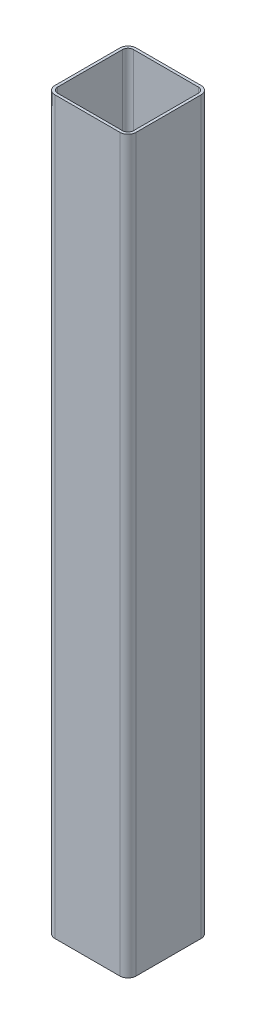
ISO-10303-21;
HEADER;
FILE_DESCRIPTION(('STEP AP214'),'2;1');
FILE_NAME('part.step','',(''),(''),'','','');
FILE_SCHEMA(('AUTOMOTIVE_DESIGN { 1 0 10303 214 1 1 1 1 }'));
ENDSEC;
DATA;
#1=APPLICATION_CONTEXT('core data for automotive mechanical design processes');
#2=APPLICATION_PROTOCOL_DEFINITION('international standard','automotive_design',2000,#1);
#3=PRODUCT_CONTEXT('',#1,'mechanical');
#4=PRODUCT('Part','Part','',(#3));
#5=PRODUCT_RELATED_PRODUCT_CATEGORY('part','',(#4));
#6=PRODUCT_DEFINITION_FORMATION('','',#4);
#7=PRODUCT_DEFINITION_CONTEXT('part definition',#1,'design');
#8=PRODUCT_DEFINITION('design','',#6,#7);
#9=PRODUCT_DEFINITION_SHAPE('','',#8);
#10=(LENGTH_UNIT() NAMED_UNIT(*) SI_UNIT(.MILLI.,.METRE.));
#11=(NAMED_UNIT(*) PLANE_ANGLE_UNIT() SI_UNIT($,.RADIAN.));
#12=(NAMED_UNIT(*) SI_UNIT($,.STERADIAN.) SOLID_ANGLE_UNIT());
#13=UNCERTAINTY_MEASURE_WITH_UNIT(LENGTH_MEASURE(1.E-05),#10,'distance_accuracy_value','');
#14=(GEOMETRIC_REPRESENTATION_CONTEXT(3) GLOBAL_UNCERTAINTY_ASSIGNED_CONTEXT((#13)) GLOBAL_UNIT_ASSIGNED_CONTEXT((#10,
#11,#12)) REPRESENTATION_CONTEXT('',''));
#15=CARTESIAN_POINT('',(0.,0.,0.));
#16=DIRECTION('',(0.,0.,1.));
#17=DIRECTION('',(1.,0.,0.));
#18=AXIS2_PLACEMENT_3D('',#15,#16,#17);
#19=CARTESIAN_POINT('',(24.,270.,24.));
#20=DIRECTION('',(0.,-1.,0.));
#21=DIRECTION('',(0.,0.,-1.));
#22=AXIS2_PLACEMENT_3D('',#19,#20,#21);
#23=PLANE('',#22);
#24=CARTESIAN_POINT('',(24.,270.,24.));
#25=DIRECTION('',(0.,1.,0.));
#26=DIRECTION('',(0.,0.,-1.));
#27=AXIS2_PLACEMENT_3D('',#24,#25,#26);
#28=CIRCLE('',#27,6.);
#29=CARTESIAN_POINT('',(24.,270.,30.));
#30=VERTEX_POINT('',#29);
#31=CARTESIAN_POINT('',(30.,270.,24.));
#32=VERTEX_POINT('',#31);
#33=EDGE_CURVE('E199',#30,#32,#28,.T.);
#34=ORIENTED_EDGE('',*,*,#33,.T.);
#35=DIRECTION('',(0.,0.,-1.));
#36=VECTOR('',#35,1.);
#37=CARTESIAN_POINT('',(30.,270.,24.));
#38=LINE('',#37,#36);
#39=CARTESIAN_POINT('',(30.,270.,-24.));
#40=VERTEX_POINT('',#39);
#41=EDGE_CURVE('E202',#32,#40,#38,.T.);
#42=ORIENTED_EDGE('',*,*,#41,.T.);
#43=CARTESIAN_POINT('',(24.,270.,-24.));
#44=DIRECTION('',(0.,1.,0.));
#45=DIRECTION('',(0.,0.,1.));
#46=AXIS2_PLACEMENT_3D('',#43,#44,#45);
#47=CIRCLE('',#46,6.);
#48=CARTESIAN_POINT('',(24.,270.,-30.));
#49=VERTEX_POINT('',#48);
#50=EDGE_CURVE('E205',#40,#49,#47,.T.);
#51=ORIENTED_EDGE('',*,*,#50,.T.);
#52=DIRECTION('',(-1.,0.,0.));
#53=VECTOR('',#52,1.);
#54=CARTESIAN_POINT('',(-24.,270.,-30.));
#55=LINE('',#54,#53);
#56=CARTESIAN_POINT('',(-24.,270.,-30.));
#57=VERTEX_POINT('',#56);
#58=EDGE_CURVE('E207',#49,#57,#55,.T.);
#59=ORIENTED_EDGE('',*,*,#58,.T.);
#60=CARTESIAN_POINT('',(-24.,270.,-24.));
#61=DIRECTION('',(0.,1.,0.));
#62=DIRECTION('',(0.,0.,1.));
#63=AXIS2_PLACEMENT_3D('',#60,#61,#62);
#64=CIRCLE('',#63,6.);
#65=CARTESIAN_POINT('',(-30.,270.,-24.));
#66=VERTEX_POINT('',#65);
#67=EDGE_CURVE('E209',#57,#66,#64,.T.);
#68=ORIENTED_EDGE('',*,*,#67,.T.);
#69=DIRECTION('',(0.,0.,1.));
#70=VECTOR('',#69,1.);
#71=CARTESIAN_POINT('',(-30.,270.,24.));
#72=LINE('',#71,#70);
#73=CARTESIAN_POINT('',(-30.,270.,24.));
#74=VERTEX_POINT('',#73);
#75=EDGE_CURVE('E211',#66,#74,#72,.T.);
#76=ORIENTED_EDGE('',*,*,#75,.T.);
#77=CARTESIAN_POINT('',(-24.,270.,24.));
#78=DIRECTION('',(0.,1.,0.));
#79=DIRECTION('',(0.,0.,-1.));
#80=AXIS2_PLACEMENT_3D('',#77,#78,#79);
#81=CIRCLE('',#80,6.);
#82=CARTESIAN_POINT('',(-24.,270.,30.));
#83=VERTEX_POINT('',#82);
#84=EDGE_CURVE('E213',#74,#83,#81,.T.);
#85=ORIENTED_EDGE('',*,*,#84,.T.);
#86=DIRECTION('',(1.,0.,0.));
#87=VECTOR('',#86,1.);
#88=CARTESIAN_POINT('',(-24.,270.,30.));
#89=LINE('',#88,#87);
#90=EDGE_CURVE('E215',#83,#30,#89,.T.);
#91=ORIENTED_EDGE('',*,*,#90,.T.);
#92=EDGE_LOOP('',(#34,#42,#51,#59,#68,#76,#85,#91));
#93=FACE_BOUND('',#92,.T.);
#94=CARTESIAN_POINT('',(24.,270.,24.));
#95=DIRECTION('',(0.,-1.,0.));
#96=DIRECTION('',(0.,0.,-1.));
#97=AXIS2_PLACEMENT_3D('',#94,#95,#96);
#98=CIRCLE('',#97,4.);
#99=CARTESIAN_POINT('',(24.,270.,28.));
#100=VERTEX_POINT('',#99);
#101=CARTESIAN_POINT('',(28.,270.,24.));
#102=VERTEX_POINT('',#101);
#103=EDGE_CURVE('E170',#100,#102,#98,.F.);
#104=ORIENTED_EDGE('',*,*,#103,.F.);
#105=DIRECTION('',(1.,0.,0.));
#106=VECTOR('',#105,1.);
#107=CARTESIAN_POINT('',(24.,270.,28.));
#108=LINE('',#107,#106);
#109=CARTESIAN_POINT('',(-24.,270.,28.));
#110=VERTEX_POINT('',#109);
#111=EDGE_CURVE('E152',#110,#100,#108,.T.);
#112=ORIENTED_EDGE('',*,*,#111,.F.);
#113=CARTESIAN_POINT('',(-24.,270.,24.));
#114=DIRECTION('',(0.,-1.,0.));
#115=DIRECTION('',(0.,0.,-1.));
#116=AXIS2_PLACEMENT_3D('',#113,#114,#115);
#117=CIRCLE('',#116,4.);
#118=CARTESIAN_POINT('',(-28.,270.,24.));
#119=VERTEX_POINT('',#118);
#120=EDGE_CURVE('E196',#119,#110,#117,.F.);
#121=ORIENTED_EDGE('',*,*,#120,.F.);
#122=DIRECTION('',(0.,0.,1.));
#123=VECTOR('',#122,1.);
#124=CARTESIAN_POINT('',(-28.,270.,24.));
#125=LINE('',#124,#123);
#126=CARTESIAN_POINT('',(-28.,270.,-24.));
#127=VERTEX_POINT('',#126);
#128=EDGE_CURVE('E194',#127,#119,#125,.T.);
#129=ORIENTED_EDGE('',*,*,#128,.F.);
#130=CARTESIAN_POINT('',(-24.,270.,-24.));
#131=DIRECTION('',(0.,-1.,0.));
#132=DIRECTION('',(0.,0.,-1.));
#133=AXIS2_PLACEMENT_3D('',#130,#131,#132);
#134=CIRCLE('',#133,4.);
#135=CARTESIAN_POINT('',(-24.,270.,-28.));
#136=VERTEX_POINT('',#135);
#137=EDGE_CURVE('E192',#136,#127,#134,.F.);
#138=ORIENTED_EDGE('',*,*,#137,.F.);
#139=DIRECTION('',(-1.,0.,0.));
#140=VECTOR('',#139,1.);
#141=CARTESIAN_POINT('',(24.,270.,-28.));
#142=LINE('',#141,#140);
#143=CARTESIAN_POINT('',(24.,270.,-28.));
#144=VERTEX_POINT('',#143);
#145=EDGE_CURVE('E190',#144,#136,#142,.T.);
#146=ORIENTED_EDGE('',*,*,#145,.F.);
#147=CARTESIAN_POINT('',(24.,270.,-24.));
#148=DIRECTION('',(0.,-1.,0.));
#149=DIRECTION('',(0.,0.,-1.));
#150=AXIS2_PLACEMENT_3D('',#147,#148,#149);
#151=CIRCLE('',#150,4.);
#152=CARTESIAN_POINT('',(28.,270.,-24.));
#153=VERTEX_POINT('',#152);
#154=EDGE_CURVE('E188',#153,#144,#151,.F.);
#155=ORIENTED_EDGE('',*,*,#154,.F.);
#156=DIRECTION('',(0.,0.,-1.));
#157=VECTOR('',#156,1.);
#158=CARTESIAN_POINT('',(28.,270.,24.));
#159=LINE('',#158,#157);
#160=EDGE_CURVE('E172',#102,#153,#159,.T.);
#161=ORIENTED_EDGE('',*,*,#160,.F.);
#162=EDGE_LOOP('',(#104,#112,#121,#129,#138,#146,#155,#161));
#163=FACE_BOUND('',#162,.T.);
#164=ADVANCED_FACE('F33',(#93,#163),#23,.F.);
#165=CARTESIAN_POINT('',(24.,-270.,24.));
#166=DIRECTION('',(0.,-1.,0.));
#167=DIRECTION('',(0.,0.,-1.));
#168=AXIS2_PLACEMENT_3D('',#165,#166,#167);
#169=PLANE('',#168);
#170=CARTESIAN_POINT('',(24.,-270.,24.));
#171=DIRECTION('',(0.,1.,0.));
#172=DIRECTION('',(0.,0.,-1.));
#173=AXIS2_PLACEMENT_3D('',#170,#171,#172);
#174=CIRCLE('',#173,6.);
#175=CARTESIAN_POINT('',(24.,-270.,30.));
#176=VERTEX_POINT('',#175);
#177=CARTESIAN_POINT('',(30.,-270.,24.));
#178=VERTEX_POINT('',#177);
#179=EDGE_CURVE('E218',#176,#178,#174,.T.);
#180=ORIENTED_EDGE('',*,*,#179,.F.);
#181=DIRECTION('',(1.,0.,0.));
#182=VECTOR('',#181,1.);
#183=CARTESIAN_POINT('',(-24.,-270.,30.));
#184=LINE('',#183,#182);
#185=CARTESIAN_POINT('',(-24.,-270.,30.));
#186=VERTEX_POINT('',#185);
#187=EDGE_CURVE('E203',#186,#176,#184,.T.);
#188=ORIENTED_EDGE('',*,*,#187,.F.);
#189=CARTESIAN_POINT('',(-24.,-270.,24.));
#190=DIRECTION('',(0.,1.,0.));
#191=DIRECTION('',(0.,0.,-1.));
#192=AXIS2_PLACEMENT_3D('',#189,#190,#191);
#193=CIRCLE('',#192,6.);
#194=CARTESIAN_POINT('',(-30.,-270.,24.));
#195=VERTEX_POINT('',#194);
#196=EDGE_CURVE('E231',#195,#186,#193,.T.);
#197=ORIENTED_EDGE('',*,*,#196,.F.);
#198=DIRECTION('',(0.,0.,1.));
#199=VECTOR('',#198,1.);
#200=CARTESIAN_POINT('',(-30.,-270.,24.));
#201=LINE('',#200,#199);
#202=CARTESIAN_POINT('',(-30.,-270.,-24.));
#203=VERTEX_POINT('',#202);
#204=EDGE_CURVE('E229',#203,#195,#201,.T.);
#205=ORIENTED_EDGE('',*,*,#204,.F.);
#206=CARTESIAN_POINT('',(-24.,-270.,-24.));
#207=DIRECTION('',(0.,1.,0.));
#208=DIRECTION('',(0.,0.,1.));
#209=AXIS2_PLACEMENT_3D('',#206,#207,#208);
#210=CIRCLE('',#209,6.);
#211=CARTESIAN_POINT('',(-24.,-270.,-30.));
#212=VERTEX_POINT('',#211);
#213=EDGE_CURVE('E227',#212,#203,#210,.T.);
#214=ORIENTED_EDGE('',*,*,#213,.F.);
#215=DIRECTION('',(-1.,0.,0.));
#216=VECTOR('',#215,1.);
#217=CARTESIAN_POINT('',(-24.,-270.,-30.));
#218=LINE('',#217,#216);
#219=CARTESIAN_POINT('',(24.,-270.,-30.));
#220=VERTEX_POINT('',#219);
#221=EDGE_CURVE('E225',#220,#212,#218,.T.);
#222=ORIENTED_EDGE('',*,*,#221,.F.);
#223=CARTESIAN_POINT('',(24.,-270.,-24.));
#224=DIRECTION('',(0.,1.,0.));
#225=DIRECTION('',(0.,0.,1.));
#226=AXIS2_PLACEMENT_3D('',#223,#224,#225);
#227=CIRCLE('',#226,6.);
#228=CARTESIAN_POINT('',(30.,-270.,-24.));
#229=VERTEX_POINT('',#228);
#230=EDGE_CURVE('E223',#229,#220,#227,.T.);
#231=ORIENTED_EDGE('',*,*,#230,.F.);
#232=DIRECTION('',(0.,0.,-1.));
#233=VECTOR('',#232,1.);
#234=CARTESIAN_POINT('',(30.,-270.,24.));
#235=LINE('',#234,#233);
#236=EDGE_CURVE('E221',#178,#229,#235,.T.);
#237=ORIENTED_EDGE('',*,*,#236,.F.);
#238=EDGE_LOOP('',(#180,#188,#197,#205,#214,#222,#231,#237));
#239=FACE_BOUND('',#238,.T.);
#240=DIRECTION('',(1.,0.,0.));
#241=VECTOR('',#240,1.);
#242=CARTESIAN_POINT('',(24.,-270.,28.));
#243=LINE('',#242,#241);
#244=CARTESIAN_POINT('',(-24.,-270.,28.));
#245=VERTEX_POINT('',#244);
#246=CARTESIAN_POINT('',(24.,-270.,28.));
#247=VERTEX_POINT('',#246);
#248=EDGE_CURVE('E149',#245,#247,#243,.T.);
#249=ORIENTED_EDGE('',*,*,#248,.T.);
#250=CARTESIAN_POINT('',(24.,-270.,24.));
#251=DIRECTION('',(0.,-1.,0.));
#252=DIRECTION('',(0.,0.,-1.));
#253=AXIS2_PLACEMENT_3D('',#250,#251,#252);
#254=CIRCLE('',#253,4.);
#255=CARTESIAN_POINT('',(28.,-270.,24.));
#256=VERTEX_POINT('',#255);
#257=EDGE_CURVE('E158',#247,#256,#254,.F.);
#258=ORIENTED_EDGE('',*,*,#257,.T.);
#259=DIRECTION('',(0.,0.,-1.));
#260=VECTOR('',#259,1.);
#261=CARTESIAN_POINT('',(28.,-270.,24.));
#262=LINE('',#261,#260);
#263=CARTESIAN_POINT('',(28.,-270.,-24.));
#264=VERTEX_POINT('',#263);
#265=EDGE_CURVE('E164',#256,#264,#262,.T.);
#266=ORIENTED_EDGE('',*,*,#265,.T.);
#267=CARTESIAN_POINT('',(24.,-270.,-24.));
#268=DIRECTION('',(0.,-1.,0.));
#269=DIRECTION('',(0.,0.,-1.));
#270=AXIS2_PLACEMENT_3D('',#267,#268,#269);
#271=CIRCLE('',#270,4.);
#272=CARTESIAN_POINT('',(24.,-270.,-28.));
#273=VERTEX_POINT('',#272);
#274=EDGE_CURVE('E56',#264,#273,#271,.F.);
#275=ORIENTED_EDGE('',*,*,#274,.T.);
#276=DIRECTION('',(-1.,0.,0.));
#277=VECTOR('',#276,1.);
#278=CARTESIAN_POINT('',(24.,-270.,-28.));
#279=LINE('',#278,#277);
#280=CARTESIAN_POINT('',(-24.,-270.,-28.));
#281=VERTEX_POINT('',#280);
#282=EDGE_CURVE('E182',#273,#281,#279,.T.);
#283=ORIENTED_EDGE('',*,*,#282,.T.);
#284=CARTESIAN_POINT('',(-24.,-270.,-24.));
#285=DIRECTION('',(0.,-1.,0.));
#286=DIRECTION('',(0.,0.,-1.));
#287=AXIS2_PLACEMENT_3D('',#284,#285,#286);
#288=CIRCLE('',#287,4.);
#289=CARTESIAN_POINT('',(-28.,-270.,-24.));
#290=VERTEX_POINT('',#289);
#291=EDGE_CURVE('E179',#281,#290,#288,.F.);
#292=ORIENTED_EDGE('',*,*,#291,.T.);
#293=DIRECTION('',(0.,0.,1.));
#294=VECTOR('',#293,1.);
#295=CARTESIAN_POINT('',(-28.,-270.,24.));
#296=LINE('',#295,#294);
#297=CARTESIAN_POINT('',(-28.,-270.,24.));
#298=VERTEX_POINT('',#297);
#299=EDGE_CURVE('E174',#290,#298,#296,.T.);
#300=ORIENTED_EDGE('',*,*,#299,.T.);
#301=CARTESIAN_POINT('',(-24.,-270.,24.));
#302=DIRECTION('',(0.,-1.,0.));
#303=DIRECTION('',(0.,0.,-1.));
#304=AXIS2_PLACEMENT_3D('',#301,#302,#303);
#305=CIRCLE('',#304,4.);
#306=EDGE_CURVE('E169',#298,#245,#305,.F.);
#307=ORIENTED_EDGE('',*,*,#306,.T.);
#308=EDGE_LOOP('',(#249,#258,#266,#275,#283,#292,#300,#307));
#309=FACE_BOUND('',#308,.T.);
#310=ADVANCED_FACE('F166',(#239,#309),#169,.T.);
#311=CARTESIAN_POINT('',(24.,270.,24.));
#312=DIRECTION('',(0.,-1.,0.));
#313=DIRECTION('',(0.,0.,-1.));
#314=AXIS2_PLACEMENT_3D('',#311,#312,#313);
#315=CYLINDRICAL_SURFACE('',#314,6.);
#316=ORIENTED_EDGE('',*,*,#179,.T.);
#317=DIRECTION('',(0.,-1.,0.));
#318=VECTOR('',#317,1.);
#319=CARTESIAN_POINT('',(30.,270.,24.));
#320=LINE('',#319,#318);
#321=EDGE_CURVE('E11',#32,#178,#320,.T.);
#322=ORIENTED_EDGE('',*,*,#321,.F.);
#323=ORIENTED_EDGE('',*,*,#33,.F.);
#324=DIRECTION('',(0.,-1.,0.));
#325=VECTOR('',#324,1.);
#326=CARTESIAN_POINT('',(24.,270.,30.));
#327=LINE('',#326,#325);
#328=EDGE_CURVE('E217',#30,#176,#327,.T.);
#329=ORIENTED_EDGE('',*,*,#328,.T.);
#330=EDGE_LOOP('',(#316,#322,#323,#329));
#331=FACE_BOUND('',#330,.T.);
#332=ADVANCED_FACE('F35',(#331),#315,.T.);
#333=CARTESIAN_POINT('',(30.,270.,24.));
#334=DIRECTION('',(-1.,0.,0.));
#335=DIRECTION('',(0.,0.,1.));
#336=AXIS2_PLACEMENT_3D('',#333,#334,#335);
#337=PLANE('',#336);
#338=ORIENTED_EDGE('',*,*,#236,.T.);
#339=DIRECTION('',(0.,-1.,0.));
#340=VECTOR('',#339,1.);
#341=CARTESIAN_POINT('',(30.,270.,-24.));
#342=LINE('',#341,#340);
#343=EDGE_CURVE('E41',#40,#229,#342,.T.);
#344=ORIENTED_EDGE('',*,*,#343,.F.);
#345=ORIENTED_EDGE('',*,*,#41,.F.);
#346=ORIENTED_EDGE('',*,*,#321,.T.);
#347=EDGE_LOOP('',(#338,#344,#345,#346));
#348=FACE_BOUND('',#347,.T.);
#349=ADVANCED_FACE('F277',(#348),#337,.F.);
#350=CARTESIAN_POINT('',(24.,270.,-24.));
#351=DIRECTION('',(0.,-1.,0.));
#352=DIRECTION('',(0.,0.,-1.));
#353=AXIS2_PLACEMENT_3D('',#350,#351,#352);
#354=CYLINDRICAL_SURFACE('',#353,6.);
#355=ORIENTED_EDGE('',*,*,#230,.T.);
#356=DIRECTION('',(0.,-1.,0.));
#357=VECTOR('',#356,1.);
#358=CARTESIAN_POINT('',(24.,270.,-30.));
#359=LINE('',#358,#357);
#360=EDGE_CURVE('E248',#49,#220,#359,.T.);
#361=ORIENTED_EDGE('',*,*,#360,.F.);
#362=ORIENTED_EDGE('',*,*,#50,.F.);
#363=ORIENTED_EDGE('',*,*,#343,.T.);
#364=EDGE_LOOP('',(#355,#361,#362,#363));
#365=FACE_BOUND('',#364,.T.);
#366=ADVANCED_FACE('F255',(#365),#354,.T.);
#367=CARTESIAN_POINT('',(-24.,270.,-30.));
#368=DIRECTION('',(0.,0.,1.));
#369=DIRECTION('',(1.,0.,0.));
#370=AXIS2_PLACEMENT_3D('',#367,#368,#369);
#371=PLANE('',#370);
#372=ORIENTED_EDGE('',*,*,#221,.T.);
#373=DIRECTION('',(0.,-1.,0.));
#374=VECTOR('',#373,1.);
#375=CARTESIAN_POINT('',(-24.,270.,-30.));
#376=LINE('',#375,#374);
#377=EDGE_CURVE('E245',#57,#212,#376,.T.);
#378=ORIENTED_EDGE('',*,*,#377,.F.);
#379=ORIENTED_EDGE('',*,*,#58,.F.);
#380=ORIENTED_EDGE('',*,*,#360,.T.);
#381=EDGE_LOOP('',(#372,#378,#379,#380));
#382=FACE_BOUND('',#381,.T.);
#383=ADVANCED_FACE('F265',(#382),#371,.F.);
#384=CARTESIAN_POINT('',(-24.,270.,-24.));
#385=DIRECTION('',(0.,-1.,0.));
#386=DIRECTION('',(0.,0.,-1.));
#387=AXIS2_PLACEMENT_3D('',#384,#385,#386);
#388=CYLINDRICAL_SURFACE('',#387,6.);
#389=ORIENTED_EDGE('',*,*,#213,.T.);
#390=DIRECTION('',(0.,-1.,0.));
#391=VECTOR('',#390,1.);
#392=CARTESIAN_POINT('',(-30.,270.,-24.));
#393=LINE('',#392,#391);
#394=EDGE_CURVE('E242',#66,#203,#393,.T.);
#395=ORIENTED_EDGE('',*,*,#394,.F.);
#396=ORIENTED_EDGE('',*,*,#67,.F.);
#397=ORIENTED_EDGE('',*,*,#377,.T.);
#398=EDGE_LOOP('',(#389,#395,#396,#397));
#399=FACE_BOUND('',#398,.T.);
#400=ADVANCED_FACE('F269',(#399),#388,.T.);
#401=CARTESIAN_POINT('',(-30.,270.,24.));
#402=DIRECTION('',(1.,0.,0.));
#403=DIRECTION('',(0.,0.,-1.));
#404=AXIS2_PLACEMENT_3D('',#401,#402,#403);
#405=PLANE('',#404);
#406=ORIENTED_EDGE('',*,*,#204,.T.);
#407=DIRECTION('',(0.,-1.,0.));
#408=VECTOR('',#407,1.);
#409=CARTESIAN_POINT('',(-30.,270.,24.));
#410=LINE('',#409,#408);
#411=EDGE_CURVE('E239',#74,#195,#410,.T.);
#412=ORIENTED_EDGE('',*,*,#411,.F.);
#413=ORIENTED_EDGE('',*,*,#75,.F.);
#414=ORIENTED_EDGE('',*,*,#394,.T.);
#415=EDGE_LOOP('',(#406,#412,#413,#414));
#416=FACE_BOUND('',#415,.T.);
#417=ADVANCED_FACE('F290',(#416),#405,.F.);
#418=CARTESIAN_POINT('',(-24.,270.,24.));
#419=DIRECTION('',(0.,-1.,0.));
#420=DIRECTION('',(0.,0.,-1.));
#421=AXIS2_PLACEMENT_3D('',#418,#419,#420);
#422=CYLINDRICAL_SURFACE('',#421,6.);
#423=ORIENTED_EDGE('',*,*,#196,.T.);
#424=DIRECTION('',(0.,-1.,0.));
#425=VECTOR('',#424,1.);
#426=CARTESIAN_POINT('',(-24.,270.,30.));
#427=LINE('',#426,#425);
#428=EDGE_CURVE('E236',#83,#186,#427,.T.);
#429=ORIENTED_EDGE('',*,*,#428,.F.);
#430=ORIENTED_EDGE('',*,*,#84,.F.);
#431=ORIENTED_EDGE('',*,*,#411,.T.);
#432=EDGE_LOOP('',(#423,#429,#430,#431));
#433=FACE_BOUND('',#432,.T.);
#434=ADVANCED_FACE('F288',(#433),#422,.T.);
#435=CARTESIAN_POINT('',(-24.,270.,30.));
#436=DIRECTION('',(0.,0.,-1.));
#437=DIRECTION('',(-1.,0.,0.));
#438=AXIS2_PLACEMENT_3D('',#435,#436,#437);
#439=PLANE('',#438);
#440=ORIENTED_EDGE('',*,*,#187,.T.);
#441=ORIENTED_EDGE('',*,*,#328,.F.);
#442=ORIENTED_EDGE('',*,*,#90,.F.);
#443=ORIENTED_EDGE('',*,*,#428,.T.);
#444=EDGE_LOOP('',(#440,#441,#442,#443));
#445=FACE_BOUND('',#444,.T.);
#446=ADVANCED_FACE('F283',(#445),#439,.F.);
#447=CARTESIAN_POINT('',(24.,270.,24.));
#448=DIRECTION('',(0.,-1.,0.));
#449=DIRECTION('',(0.,0.,-1.));
#450=AXIS2_PLACEMENT_3D('',#447,#448,#449);
#451=CYLINDRICAL_SURFACE('',#450,4.);
#452=ORIENTED_EDGE('',*,*,#257,.F.);
#453=DIRECTION('',(0.,-1.,0.));
#454=VECTOR('',#453,1.);
#455=CARTESIAN_POINT('',(24.,270.,28.));
#456=LINE('',#455,#454);
#457=EDGE_CURVE('E145',#100,#247,#456,.T.);
#458=ORIENTED_EDGE('',*,*,#457,.F.);
#459=ORIENTED_EDGE('',*,*,#103,.T.);
#460=DIRECTION('',(0.,1.,0.));
#461=VECTOR('',#460,1.);
#462=CARTESIAN_POINT('',(28.,270.,24.));
#463=LINE('',#462,#461);
#464=EDGE_CURVE('E161',#102,#256,#463,.F.);
#465=ORIENTED_EDGE('',*,*,#464,.T.);
#466=EDGE_LOOP('',(#452,#458,#459,#465));
#467=FACE_BOUND('',#466,.T.);
#468=ADVANCED_FACE('F159',(#467),#451,.F.);
#469=CARTESIAN_POINT('',(28.,270.,24.));
#470=DIRECTION('',(-1.,0.,0.));
#471=DIRECTION('',(0.,0.,1.));
#472=AXIS2_PLACEMENT_3D('',#469,#470,#471);
#473=PLANE('',#472);
#474=ORIENTED_EDGE('',*,*,#265,.F.);
#475=ORIENTED_EDGE('',*,*,#464,.F.);
#476=ORIENTED_EDGE('',*,*,#160,.T.);
#477=DIRECTION('',(0.,-1.,0.));
#478=VECTOR('',#477,1.);
#479=CARTESIAN_POINT('',(28.,270.,-24.));
#480=LINE('',#479,#478);
#481=EDGE_CURVE('E355',#153,#264,#480,.T.);
#482=ORIENTED_EDGE('',*,*,#481,.T.);
#483=EDGE_LOOP('',(#474,#475,#476,#482));
#484=FACE_BOUND('',#483,.T.);
#485=ADVANCED_FACE('F312',(#484),#473,.T.);
#486=CARTESIAN_POINT('',(24.,270.,-24.));
#487=DIRECTION('',(0.,-1.,0.));
#488=DIRECTION('',(0.,0.,-1.));
#489=AXIS2_PLACEMENT_3D('',#486,#487,#488);
#490=CYLINDRICAL_SURFACE('',#489,4.);
#491=ORIENTED_EDGE('',*,*,#274,.F.);
#492=ORIENTED_EDGE('',*,*,#481,.F.);
#493=ORIENTED_EDGE('',*,*,#154,.T.);
#494=DIRECTION('',(0.,1.,0.));
#495=VECTOR('',#494,1.);
#496=CARTESIAN_POINT('',(24.,270.,-28.));
#497=LINE('',#496,#495);
#498=EDGE_CURVE('E353',#144,#273,#497,.F.);
#499=ORIENTED_EDGE('',*,*,#498,.T.);
#500=EDGE_LOOP('',(#491,#492,#493,#499));
#501=FACE_BOUND('',#500,.T.);
#502=ADVANCED_FACE('F317',(#501),#490,.F.);
#503=CARTESIAN_POINT('',(-24.,270.,-28.));
#504=DIRECTION('',(0.,0.,1.));
#505=DIRECTION('',(1.,0.,0.));
#506=AXIS2_PLACEMENT_3D('',#503,#504,#505);
#507=PLANE('',#506);
#508=ORIENTED_EDGE('',*,*,#282,.F.);
#509=ORIENTED_EDGE('',*,*,#498,.F.);
#510=ORIENTED_EDGE('',*,*,#145,.T.);
#511=DIRECTION('',(0.,-1.,0.));
#512=VECTOR('',#511,1.);
#513=CARTESIAN_POINT('',(-24.,270.,-28.));
#514=LINE('',#513,#512);
#515=EDGE_CURVE('E349',#136,#281,#514,.T.);
#516=ORIENTED_EDGE('',*,*,#515,.T.);
#517=EDGE_LOOP('',(#508,#509,#510,#516));
#518=FACE_BOUND('',#517,.T.);
#519=ADVANCED_FACE('F323',(#518),#507,.T.);
#520=CARTESIAN_POINT('',(-24.,270.,-24.));
#521=DIRECTION('',(0.,-1.,0.));
#522=DIRECTION('',(0.,0.,-1.));
#523=AXIS2_PLACEMENT_3D('',#520,#521,#522);
#524=CYLINDRICAL_SURFACE('',#523,4.);
#525=ORIENTED_EDGE('',*,*,#291,.F.);
#526=ORIENTED_EDGE('',*,*,#515,.F.);
#527=ORIENTED_EDGE('',*,*,#137,.T.);
#528=DIRECTION('',(0.,1.,0.));
#529=VECTOR('',#528,1.);
#530=CARTESIAN_POINT('',(-28.,270.,-24.));
#531=LINE('',#530,#529);
#532=EDGE_CURVE('E346',#127,#290,#531,.F.);
#533=ORIENTED_EDGE('',*,*,#532,.T.);
#534=EDGE_LOOP('',(#525,#526,#527,#533));
#535=FACE_BOUND('',#534,.T.);
#536=ADVANCED_FACE('F326',(#535),#524,.F.);
#537=CARTESIAN_POINT('',(-28.,270.,24.));
#538=DIRECTION('',(1.,0.,0.));
#539=DIRECTION('',(0.,0.,-1.));
#540=AXIS2_PLACEMENT_3D('',#537,#538,#539);
#541=PLANE('',#540);
#542=ORIENTED_EDGE('',*,*,#299,.F.);
#543=ORIENTED_EDGE('',*,*,#532,.F.);
#544=ORIENTED_EDGE('',*,*,#128,.T.);
#545=DIRECTION('',(0.,-1.,0.));
#546=VECTOR('',#545,1.);
#547=CARTESIAN_POINT('',(-28.,270.,24.));
#548=LINE('',#547,#546);
#549=EDGE_CURVE('E341',#119,#298,#548,.T.);
#550=ORIENTED_EDGE('',*,*,#549,.T.);
#551=EDGE_LOOP('',(#542,#543,#544,#550));
#552=FACE_BOUND('',#551,.T.);
#553=ADVANCED_FACE('F330',(#552),#541,.T.);
#554=CARTESIAN_POINT('',(-24.,270.,24.));
#555=DIRECTION('',(0.,-1.,0.));
#556=DIRECTION('',(0.,0.,-1.));
#557=AXIS2_PLACEMENT_3D('',#554,#555,#556);
#558=CYLINDRICAL_SURFACE('',#557,4.);
#559=ORIENTED_EDGE('',*,*,#306,.F.);
#560=ORIENTED_EDGE('',*,*,#549,.F.);
#561=ORIENTED_EDGE('',*,*,#120,.T.);
#562=DIRECTION('',(0.,1.,0.));
#563=VECTOR('',#562,1.);
#564=CARTESIAN_POINT('',(-24.,270.,28.));
#565=LINE('',#564,#563);
#566=EDGE_CURVE('E48',#110,#245,#565,.F.);
#567=ORIENTED_EDGE('',*,*,#566,.T.);
#568=EDGE_LOOP('',(#559,#560,#561,#567));
#569=FACE_BOUND('',#568,.T.);
#570=ADVANCED_FACE('F333',(#569),#558,.F.);
#571=CARTESIAN_POINT('',(-24.,270.,28.));
#572=DIRECTION('',(0.,0.,-1.));
#573=DIRECTION('',(-1.,0.,0.));
#574=AXIS2_PLACEMENT_3D('',#571,#572,#573);
#575=PLANE('',#574);
#576=ORIENTED_EDGE('',*,*,#248,.F.);
#577=ORIENTED_EDGE('',*,*,#566,.F.);
#578=ORIENTED_EDGE('',*,*,#111,.T.);
#579=ORIENTED_EDGE('',*,*,#457,.T.);
#580=EDGE_LOOP('',(#576,#577,#578,#579));
#581=FACE_BOUND('',#580,.T.);
#582=ADVANCED_FACE('F147',(#581),#575,.T.);
#583=CLOSED_SHELL('',(#164,#310,#332,#349,#366,#383,#400,#417,#434,#446,#468,#485,#502,#519,
#536,#553,#570,#582));
#584=MANIFOLD_SOLID_BREP('B2',#583);
#585=ADVANCED_BREP_SHAPE_REPRESENTATION('',(#18,#584),#14);
#586=SHAPE_DEFINITION_REPRESENTATION(#9,#585);
ENDSEC;
END-ISO-10303-21;
